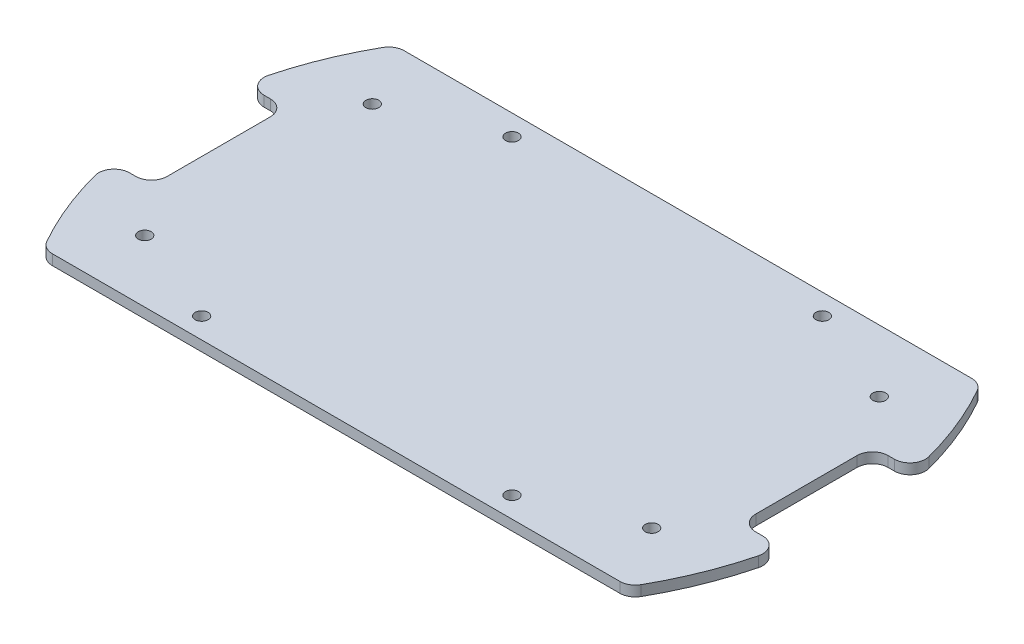
ISO-10303-21;
HEADER;
FILE_DESCRIPTION(('STEP AP214'),'2;1');
FILE_NAME('part.step','',(''),(''),'','','');
FILE_SCHEMA(('AUTOMOTIVE_DESIGN { 1 0 10303 214 1 1 1 1 }'));
ENDSEC;
DATA;
#1=APPLICATION_CONTEXT('core data for automotive mechanical design processes');
#2=APPLICATION_PROTOCOL_DEFINITION('international standard','automotive_design',2000,#1);
#3=PRODUCT_CONTEXT('',#1,'mechanical');
#4=PRODUCT('Part','Part','',(#3));
#5=PRODUCT_RELATED_PRODUCT_CATEGORY('part','',(#4));
#6=PRODUCT_DEFINITION_FORMATION('','',#4);
#7=PRODUCT_DEFINITION_CONTEXT('part definition',#1,'design');
#8=PRODUCT_DEFINITION('design','',#6,#7);
#9=PRODUCT_DEFINITION_SHAPE('','',#8);
#10=(LENGTH_UNIT() NAMED_UNIT(*) SI_UNIT(.MILLI.,.METRE.));
#11=(NAMED_UNIT(*) PLANE_ANGLE_UNIT() SI_UNIT($,.RADIAN.));
#12=(NAMED_UNIT(*) SI_UNIT($,.STERADIAN.) SOLID_ANGLE_UNIT());
#13=UNCERTAINTY_MEASURE_WITH_UNIT(LENGTH_MEASURE(1.E-05),#10,'distance_accuracy_value','');
#14=(GEOMETRIC_REPRESENTATION_CONTEXT(3) GLOBAL_UNCERTAINTY_ASSIGNED_CONTEXT((#13)) GLOBAL_UNIT_ASSIGNED_CONTEXT((#10,
#11,#12)) REPRESENTATION_CONTEXT('',''));
#15=CARTESIAN_POINT('',(0.,0.,0.));
#16=DIRECTION('',(0.,0.,1.));
#17=DIRECTION('',(1.,0.,0.));
#18=AXIS2_PLACEMENT_3D('',#15,#16,#17);
#19=CARTESIAN_POINT('',(-56.7070320753471,2.,0.));
#20=DIRECTION('',(1.,0.,0.));
#21=DIRECTION('',(0.,0.,-1.));
#22=AXIS2_PLACEMENT_3D('',#19,#20,#21);
#23=PLANE('',#22);
#24=DIRECTION('',(0.,0.,1.));
#25=VECTOR('',#24,1.);
#26=CARTESIAN_POINT('',(-56.7070320753471,0.,0.));
#27=LINE('',#26,#25);
#28=CARTESIAN_POINT('',(-56.7070320753471,0.,-9.99999999999999));
#29=VERTEX_POINT('',#28);
#30=CARTESIAN_POINT('',(-56.7070320753471,0.,9.98328326306578));
#31=VERTEX_POINT('',#30);
#32=EDGE_CURVE('E236',#29,#31,#27,.T.);
#33=ORIENTED_EDGE('',*,*,#32,.T.);
#34=DIRECTION('',(0.,-1.,0.));
#35=VECTOR('',#34,1.);
#36=CARTESIAN_POINT('',(-56.7070320753471,2.,9.98328326306578));
#37=LINE('',#36,#35);
#38=CARTESIAN_POINT('',(-56.7070320753471,2.,9.98328326306578));
#39=VERTEX_POINT('',#38);
#40=EDGE_CURVE('E331',#31,#39,#37,.F.);
#41=ORIENTED_EDGE('',*,*,#40,.T.);
#42=DIRECTION('',(0.,0.,1.));
#43=VECTOR('',#42,1.);
#44=CARTESIAN_POINT('',(-56.7070320753471,2.,0.));
#45=LINE('',#44,#43);
#46=CARTESIAN_POINT('',(-56.7070320753471,2.,-9.99999999999999));
#47=VERTEX_POINT('',#46);
#48=EDGE_CURVE('E226',#47,#39,#45,.T.);
#49=ORIENTED_EDGE('',*,*,#48,.F.);
#50=DIRECTION('',(0.,-1.,0.));
#51=VECTOR('',#50,1.);
#52=CARTESIAN_POINT('',(-56.7070320753471,0.,-9.99999999999999));
#53=LINE('',#52,#51);
#54=EDGE_CURVE('E328',#47,#29,#53,.T.);
#55=ORIENTED_EDGE('',*,*,#54,.T.);
#56=EDGE_LOOP('',(#33,#41,#49,#55));
#57=FACE_BOUND('',#56,.T.);
#58=ADVANCED_FACE('F35',(#57),#23,.F.);
#59=CARTESIAN_POINT('',(0.0426976868972404,2.,12.7837358563144));
#60=DIRECTION('',(-0.00333998208503997,0.,-0.99999442224428));
#61=DIRECTION('',(-0.99999442224428,0.,0.00333998208503997));
#62=AXIS2_PLACEMENT_3D('',#59,#60,#61);
#63=PLANE('',#62);
#64=DIRECTION('',(0.99999442224428,0.,-0.00333998208503997));
#65=VECTOR('',#64,1.);
#66=CARTESIAN_POINT('',(0.0426976868972404,2.,12.7837358563144));
#67=LINE('',#66,#65);
#68=CARTESIAN_POINT('',(-60.9477108585727,2.,12.987443864449));
#69=VERTEX_POINT('',#68);
#70=CARTESIAN_POINT('',(-59.697012129092,2.,12.9832665297986));
#71=VERTEX_POINT('',#70);
#72=EDGE_CURVE('E368',#69,#71,#67,.T.);
#73=ORIENTED_EDGE('',*,*,#72,.T.);
#74=DIRECTION('',(0.,-1.,0.));
#75=VECTOR('',#74,1.);
#76=CARTESIAN_POINT('',(-59.697012129092,2.,12.9832665297986));
#77=LINE('',#76,#75);
#78=CARTESIAN_POINT('',(-59.697012129092,0.,12.9832665297986));
#79=VERTEX_POINT('',#78);
#80=EDGE_CURVE('E325',#71,#79,#77,.T.);
#81=ORIENTED_EDGE('',*,*,#80,.T.);
#82=DIRECTION('',(0.99999442224428,0.,-0.00333998208503997));
#83=VECTOR('',#82,1.);
#84=CARTESIAN_POINT('',(0.0426976868972404,0.,12.7837358563144));
#85=LINE('',#84,#83);
#86=CARTESIAN_POINT('',(-60.9477108585727,0.,12.987443864449));
#87=VERTEX_POINT('',#86);
#88=EDGE_CURVE('E399',#87,#79,#85,.T.);
#89=ORIENTED_EDGE('',*,*,#88,.F.);
#90=DIRECTION('',(0.,1.,0.));
#91=VECTOR('',#90,1.);
#92=CARTESIAN_POINT('',(-60.9477108585727,2.,12.987443864449));
#93=LINE('',#92,#91);
#94=EDGE_CURVE('E323',#87,#69,#93,.T.);
#95=ORIENTED_EDGE('',*,*,#94,.T.);
#96=EDGE_LOOP('',(#73,#81,#89,#95));
#97=FACE_BOUND('',#96,.T.);
#98=ADVANCED_FACE('F438',(#97),#63,.T.);
#99=CARTESIAN_POINT('',(0.,2.,0.));
#100=DIRECTION('',(0.,-1.,0.));
#101=DIRECTION('',(0.,0.,-1.));
#102=AXIS2_PLACEMENT_3D('',#99,#100,#101);
#103=CYLINDRICAL_SURFACE('',#102,66.);
#104=CARTESIAN_POINT('',(0.,0.,0.));
#105=DIRECTION('',(0.,1.,0.));
#106=DIRECTION('',(0.,0.,1.));
#107=AXIS2_PLACEMENT_3D('',#104,#105,#106);
#108=CIRCLE('',#107,66.);
#109=CARTESIAN_POINT('',(-63.839485717666,0.,16.7487331850477));
#110=VERTEX_POINT('',#109);
#111=CARTESIAN_POINT('',(-57.4569147462183,0.,32.4761904761905));
#112=VERTEX_POINT('',#111);
#113=EDGE_CURVE('E402',#110,#112,#108,.T.);
#114=ORIENTED_EDGE('',*,*,#113,.T.);
#115=DIRECTION('',(0.,-1.,0.));
#116=VECTOR('',#115,1.);
#117=CARTESIAN_POINT('',(-57.4569147462183,2.,32.4761904761905));
#118=LINE('',#117,#116);
#119=CARTESIAN_POINT('',(-57.4569147462183,2.,32.4761904761905));
#120=VERTEX_POINT('',#119);
#121=EDGE_CURVE('E340',#112,#120,#118,.F.);
#122=ORIENTED_EDGE('',*,*,#121,.T.);
#123=CARTESIAN_POINT('',(0.,2.,0.));
#124=DIRECTION('',(0.,1.,0.));
#125=DIRECTION('',(0.,0.,1.));
#126=AXIS2_PLACEMENT_3D('',#123,#124,#125);
#127=CIRCLE('',#126,66.);
#128=CARTESIAN_POINT('',(-63.839485717666,2.,16.7487331850477));
#129=VERTEX_POINT('',#128);
#130=EDGE_CURVE('E371',#129,#120,#127,.T.);
#131=ORIENTED_EDGE('',*,*,#130,.F.);
#132=DIRECTION('',(0.,-1.,0.));
#133=VECTOR('',#132,1.);
#134=CARTESIAN_POINT('',(-63.839485717666,2.,16.7487331850477));
#135=LINE('',#134,#133);
#136=EDGE_CURVE('E337',#129,#110,#135,.T.);
#137=ORIENTED_EDGE('',*,*,#136,.T.);
#138=EDGE_LOOP('',(#114,#122,#131,#137));
#139=FACE_BOUND('',#138,.T.);
#140=ADVANCED_FACE('F443',(#139),#103,.T.);
#141=CARTESIAN_POINT('',(0.,2.,34.));
#142=DIRECTION('',(0.,0.,-1.));
#143=DIRECTION('',(-1.,0.,0.));
#144=AXIS2_PLACEMENT_3D('',#141,#142,#143);
#145=PLANE('',#144);
#146=DIRECTION('',(1.,0.,0.));
#147=VECTOR('',#146,1.);
#148=CARTESIAN_POINT('',(0.,0.,34.));
#149=LINE('',#148,#147);
#150=CARTESIAN_POINT('',(-54.8452368032084,0.,34.));
#151=VERTEX_POINT('',#150);
#152=CARTESIAN_POINT('',(54.8452368032084,0.,34.));
#153=VERTEX_POINT('',#152);
#154=EDGE_CURVE('E406',#151,#153,#149,.T.);
#155=ORIENTED_EDGE('',*,*,#154,.T.);
#156=DIRECTION('',(0.,-1.,0.));
#157=VECTOR('',#156,1.);
#158=CARTESIAN_POINT('',(54.8452368032084,2.,34.));
#159=LINE('',#158,#157);
#160=CARTESIAN_POINT('',(54.8452368032084,2.,34.));
#161=VERTEX_POINT('',#160);
#162=EDGE_CURVE('E321',#153,#161,#159,.F.);
#163=ORIENTED_EDGE('',*,*,#162,.T.);
#164=DIRECTION('',(1.,0.,0.));
#165=VECTOR('',#164,1.);
#166=CARTESIAN_POINT('',(0.,2.,34.));
#167=LINE('',#166,#165);
#168=CARTESIAN_POINT('',(-54.8452368032084,2.,34.));
#169=VERTEX_POINT('',#168);
#170=EDGE_CURVE('E382',#169,#161,#167,.T.);
#171=ORIENTED_EDGE('',*,*,#170,.F.);
#172=DIRECTION('',(0.,-1.,0.));
#173=VECTOR('',#172,1.);
#174=CARTESIAN_POINT('',(-54.8452368032084,2.,34.));
#175=LINE('',#174,#173);
#176=EDGE_CURVE('E318',#169,#151,#175,.T.);
#177=ORIENTED_EDGE('',*,*,#176,.T.);
#178=EDGE_LOOP('',(#155,#163,#171,#177));
#179=FACE_BOUND('',#178,.T.);
#180=ADVANCED_FACE('F498',(#179),#145,.F.);
#181=CARTESIAN_POINT('',(0.,2.,0.));
#182=DIRECTION('',(0.,-1.,0.));
#183=DIRECTION('',(0.,0.,-1.));
#184=AXIS2_PLACEMENT_3D('',#181,#182,#183);
#185=CYLINDRICAL_SURFACE('',#184,66.);
#186=CARTESIAN_POINT('',(0.,0.,0.));
#187=DIRECTION('',(0.,1.,0.));
#188=DIRECTION('',(0.,0.,1.));
#189=AXIS2_PLACEMENT_3D('',#186,#187,#188);
#190=CIRCLE('',#189,66.);
#191=CARTESIAN_POINT('',(57.4569147462183,0.,32.4761904761905));
#192=VERTEX_POINT('',#191);
#193=CARTESIAN_POINT('',(63.9499417109376,0.,16.3219164060989));
#194=VERTEX_POINT('',#193);
#195=EDGE_CURVE('E409',#192,#194,#190,.T.);
#196=ORIENTED_EDGE('',*,*,#195,.T.);
#197=DIRECTION('',(0.,-1.,0.));
#198=VECTOR('',#197,1.);
#199=CARTESIAN_POINT('',(63.9499417109376,2.,16.3219164060989));
#200=LINE('',#199,#198);
#201=CARTESIAN_POINT('',(63.9499417109376,2.,16.3219164060989));
#202=VERTEX_POINT('',#201);
#203=EDGE_CURVE('E316',#194,#202,#200,.F.);
#204=ORIENTED_EDGE('',*,*,#203,.T.);
#205=CARTESIAN_POINT('',(0.,2.,0.));
#206=DIRECTION('',(0.,1.,0.));
#207=DIRECTION('',(0.,0.,1.));
#208=AXIS2_PLACEMENT_3D('',#205,#206,#207);
#209=CIRCLE('',#208,66.);
#210=CARTESIAN_POINT('',(57.4569147462183,2.,32.4761904761905));
#211=VERTEX_POINT('',#210);
#212=EDGE_CURVE('E379',#211,#202,#209,.T.);
#213=ORIENTED_EDGE('',*,*,#212,.F.);
#214=DIRECTION('',(0.,-1.,0.));
#215=VECTOR('',#214,1.);
#216=CARTESIAN_POINT('',(57.4569147462183,2.,32.4761904761905));
#217=LINE('',#216,#215);
#218=EDGE_CURVE('E313',#211,#192,#217,.T.);
#219=ORIENTED_EDGE('',*,*,#218,.T.);
#220=EDGE_LOOP('',(#196,#204,#213,#219));
#221=FACE_BOUND('',#220,.T.);
#222=ADVANCED_FACE('F505',(#221),#185,.T.);
#223=CARTESIAN_POINT('',(59.7170520216022,0.,12.5844234701843));
#224=VERTEX_POINT('',#223);
#225=CARTESIAN_POINT('',(61.0331062323672,0.,12.5800278481797));
#226=VERTEX_POINT('',#225);
#227=EDGE_CURVE('E403',#224,#226,#85,.T.);
#228=ORIENTED_EDGE('',*,*,#227,.F.);
#229=DIRECTION('',(0.,-1.,0.));
#230=VECTOR('',#229,1.);
#231=CARTESIAN_POINT('',(59.7170520216022,2.,12.5844234701843));
#232=LINE('',#231,#230);
#233=CARTESIAN_POINT('',(59.7170520216022,2.,12.5844234701843));
#234=VERTEX_POINT('',#233);
#235=EDGE_CURVE('E311',#224,#234,#232,.F.);
#236=ORIENTED_EDGE('',*,*,#235,.T.);
#237=CARTESIAN_POINT('',(61.0331062323672,2.,12.5800278481797));
#238=VERTEX_POINT('',#237);
#239=EDGE_CURVE('E373',#234,#238,#67,.T.);
#240=ORIENTED_EDGE('',*,*,#239,.T.);
#241=DIRECTION('',(0.,1.,0.));
#242=VECTOR('',#241,1.);
#243=CARTESIAN_POINT('',(61.0331062323672,0.,12.5800278481797));
#244=LINE('',#243,#242);
#245=EDGE_CURVE('E308',#238,#226,#244,.F.);
#246=ORIENTED_EDGE('',*,*,#245,.T.);
#247=EDGE_LOOP('',(#228,#236,#240,#246));
#248=FACE_BOUND('',#247,.T.);
#249=ADVANCED_FACE('F446',(#248),#63,.T.);
#250=CARTESIAN_POINT('',(56.7070320753471,2.,0.));
#251=DIRECTION('',(1.,0.,0.));
#252=DIRECTION('',(0.,0.,-1.));
#253=AXIS2_PLACEMENT_3D('',#250,#251,#252);
#254=PLANE('',#253);
#255=DIRECTION('',(0.,0.,1.));
#256=VECTOR('',#255,1.);
#257=CARTESIAN_POINT('',(56.7070320753471,0.,0.));
#258=LINE('',#257,#256);
#259=CARTESIAN_POINT('',(56.7070320753471,0.,-9.99999999999999));
#260=VERTEX_POINT('',#259);
#261=CARTESIAN_POINT('',(56.7070320753471,0.,9.58444020345149));
#262=VERTEX_POINT('',#261);
#263=EDGE_CURVE('E412',#260,#262,#258,.T.);
#264=ORIENTED_EDGE('',*,*,#263,.F.);
#265=DIRECTION('',(0.,-1.,0.));
#266=VECTOR('',#265,1.);
#267=CARTESIAN_POINT('',(56.7070320753471,2.,-9.99999999999999));
#268=LINE('',#267,#266);
#269=CARTESIAN_POINT('',(56.7070320753471,2.,-9.99999999999999));
#270=VERTEX_POINT('',#269);
#271=EDGE_CURVE('E306',#260,#270,#268,.F.);
#272=ORIENTED_EDGE('',*,*,#271,.T.);
#273=DIRECTION('',(0.,0.,1.));
#274=VECTOR('',#273,1.);
#275=CARTESIAN_POINT('',(56.7070320753471,2.,0.));
#276=LINE('',#275,#274);
#277=CARTESIAN_POINT('',(56.7070320753471,2.,9.58444020345149));
#278=VERTEX_POINT('',#277);
#279=EDGE_CURVE('E378',#270,#278,#276,.T.);
#280=ORIENTED_EDGE('',*,*,#279,.T.);
#281=DIRECTION('',(0.,-1.,0.));
#282=VECTOR('',#281,1.);
#283=CARTESIAN_POINT('',(56.7070320753471,0.,9.58444020345149));
#284=LINE('',#283,#282);
#285=EDGE_CURVE('E303',#278,#262,#284,.T.);
#286=ORIENTED_EDGE('',*,*,#285,.T.);
#287=EDGE_LOOP('',(#264,#272,#280,#286));
#288=FACE_BOUND('',#287,.T.);
#289=ADVANCED_FACE('F520',(#288),#254,.T.);
#290=CARTESIAN_POINT('',(0.,2.,-13.));
#291=DIRECTION('',(0.,0.,-1.));
#292=DIRECTION('',(-1.,0.,0.));
#293=AXIS2_PLACEMENT_3D('',#290,#291,#292);
#294=PLANE('',#293);
#295=DIRECTION('',(1.,0.,0.));
#296=VECTOR('',#295,1.);
#297=CARTESIAN_POINT('',(0.,0.,-13.));
#298=LINE('',#297,#296);
#299=CARTESIAN_POINT('',(59.7070320753471,0.,-13.));
#300=VERTEX_POINT('',#299);
#301=CARTESIAN_POINT('',(60.9343909463285,0.,-13.));
#302=VERTEX_POINT('',#301);
#303=EDGE_CURVE('E228',#300,#302,#298,.T.);
#304=ORIENTED_EDGE('',*,*,#303,.T.);
#305=DIRECTION('',(0.,-1.,0.));
#306=VECTOR('',#305,1.);
#307=CARTESIAN_POINT('',(60.9343909463285,2.,-13.));
#308=LINE('',#307,#306);
#309=CARTESIAN_POINT('',(60.9343909463285,2.,-13.));
#310=VERTEX_POINT('',#309);
#311=EDGE_CURVE('E301',#302,#310,#308,.F.);
#312=ORIENTED_EDGE('',*,*,#311,.T.);
#313=DIRECTION('',(1.,0.,0.));
#314=VECTOR('',#313,1.);
#315=CARTESIAN_POINT('',(0.,2.,-13.));
#316=LINE('',#315,#314);
#317=CARTESIAN_POINT('',(59.7070320753471,2.,-13.));
#318=VERTEX_POINT('',#317);
#319=EDGE_CURVE('E389',#318,#310,#316,.T.);
#320=ORIENTED_EDGE('',*,*,#319,.F.);
#321=DIRECTION('',(0.,-1.,0.));
#322=VECTOR('',#321,1.);
#323=CARTESIAN_POINT('',(59.7070320753471,2.,-13.));
#324=LINE('',#323,#322);
#325=EDGE_CURVE('E298',#318,#300,#324,.T.);
#326=ORIENTED_EDGE('',*,*,#325,.T.);
#327=EDGE_LOOP('',(#304,#312,#320,#326));
#328=FACE_BOUND('',#327,.T.);
#329=ADVANCED_FACE('F435',(#328),#294,.F.);
#330=CARTESIAN_POINT('',(0.,2.,0.));
#331=DIRECTION('',(0.,-1.,0.));
#332=DIRECTION('',(0.,0.,-1.));
#333=AXIS2_PLACEMENT_3D('',#330,#331,#332);
#334=CYLINDRICAL_SURFACE('',#333,66.);
#335=CARTESIAN_POINT('',(0.,0.,0.));
#336=DIRECTION('',(0.,1.,0.));
#337=DIRECTION('',(0.,0.,1.));
#338=AXIS2_PLACEMENT_3D('',#335,#336,#337);
#339=CIRCLE('',#338,66.);
#340=CARTESIAN_POINT('',(63.8360286104394,0.,-16.7619047619048));
#341=VERTEX_POINT('',#340);
#342=CARTESIAN_POINT('',(57.4569147462183,0.,-32.4761904761905));
#343=VERTEX_POINT('',#342);
#344=EDGE_CURVE('E229',#341,#343,#339,.T.);
#345=ORIENTED_EDGE('',*,*,#344,.T.);
#346=DIRECTION('',(0.,-1.,0.));
#347=VECTOR('',#346,1.);
#348=CARTESIAN_POINT('',(57.4569147462183,2.,-32.4761904761905));
#349=LINE('',#348,#347);
#350=CARTESIAN_POINT('',(57.4569147462183,2.,-32.4761904761905));
#351=VERTEX_POINT('',#350);
#352=EDGE_CURVE('E296',#343,#351,#349,.F.);
#353=ORIENTED_EDGE('',*,*,#352,.T.);
#354=CARTESIAN_POINT('',(0.,2.,0.));
#355=DIRECTION('',(0.,1.,0.));
#356=DIRECTION('',(0.,0.,1.));
#357=AXIS2_PLACEMENT_3D('',#354,#355,#356);
#358=CIRCLE('',#357,66.);
#359=CARTESIAN_POINT('',(63.8360286104394,2.,-16.7619047619048));
#360=VERTEX_POINT('',#359);
#361=EDGE_CURVE('E391',#360,#351,#358,.T.);
#362=ORIENTED_EDGE('',*,*,#361,.F.);
#363=DIRECTION('',(0.,-1.,0.));
#364=VECTOR('',#363,1.);
#365=CARTESIAN_POINT('',(63.8360286104394,2.,-16.7619047619048));
#366=LINE('',#365,#364);
#367=EDGE_CURVE('E293',#360,#341,#366,.T.);
#368=ORIENTED_EDGE('',*,*,#367,.T.);
#369=EDGE_LOOP('',(#345,#353,#362,#368));
#370=FACE_BOUND('',#369,.T.);
#371=ADVANCED_FACE('F419',(#370),#334,.T.);
#372=CARTESIAN_POINT('',(0.,2.,-34.));
#373=DIRECTION('',(0.,0.,-1.));
#374=DIRECTION('',(-1.,0.,0.));
#375=AXIS2_PLACEMENT_3D('',#372,#373,#374);
#376=PLANE('',#375);
#377=DIRECTION('',(1.,0.,0.));
#378=VECTOR('',#377,1.);
#379=CARTESIAN_POINT('',(0.,0.,-34.));
#380=LINE('',#379,#378);
#381=CARTESIAN_POINT('',(-54.8452368032084,0.,-34.));
#382=VERTEX_POINT('',#381);
#383=CARTESIAN_POINT('',(54.8452368032084,0.,-34.));
#384=VERTEX_POINT('',#383);
#385=EDGE_CURVE('E224',#382,#384,#380,.T.);
#386=ORIENTED_EDGE('',*,*,#385,.F.);
#387=DIRECTION('',(0.,1.,0.));
#388=VECTOR('',#387,1.);
#389=CARTESIAN_POINT('',(-54.8452368032084,2.,-34.));
#390=LINE('',#389,#388);
#391=CARTESIAN_POINT('',(-54.8452368032084,2.,-34.));
#392=VERTEX_POINT('',#391);
#393=EDGE_CURVE('E202',#382,#392,#390,.T.);
#394=ORIENTED_EDGE('',*,*,#393,.T.);
#395=DIRECTION('',(1.,0.,0.));
#396=VECTOR('',#395,1.);
#397=CARTESIAN_POINT('',(0.,2.,-34.));
#398=LINE('',#397,#396);
#399=CARTESIAN_POINT('',(54.8452368032084,2.,-34.));
#400=VERTEX_POINT('',#399);
#401=EDGE_CURVE('E394',#392,#400,#398,.T.);
#402=ORIENTED_EDGE('',*,*,#401,.T.);
#403=DIRECTION('',(0.,1.,0.));
#404=VECTOR('',#403,1.);
#405=CARTESIAN_POINT('',(54.8452368032084,0.,-34.));
#406=LINE('',#405,#404);
#407=EDGE_CURVE('E207',#400,#384,#406,.F.);
#408=ORIENTED_EDGE('',*,*,#407,.T.);
#409=EDGE_LOOP('',(#386,#394,#402,#408));
#410=FACE_BOUND('',#409,.T.);
#411=ADVANCED_FACE('F427',(#410),#376,.T.);
#412=CARTESIAN_POINT('',(0.,2.,0.));
#413=DIRECTION('',(0.,-1.,0.));
#414=DIRECTION('',(0.,0.,-1.));
#415=AXIS2_PLACEMENT_3D('',#412,#413,#414);
#416=CYLINDRICAL_SURFACE('',#415,66.);
#417=CARTESIAN_POINT('',(0.,2.,0.));
#418=DIRECTION('',(0.,1.,0.));
#419=DIRECTION('',(0.,0.,1.));
#420=AXIS2_PLACEMENT_3D('',#417,#418,#419);
#421=CIRCLE('',#420,66.);
#422=CARTESIAN_POINT('',(-57.4569147462183,2.,-32.4761904761905));
#423=VERTEX_POINT('',#422);
#424=CARTESIAN_POINT('',(-63.8360286104394,2.,-16.7619047619048));
#425=VERTEX_POINT('',#424);
#426=EDGE_CURVE('E216',#423,#425,#421,.T.);
#427=ORIENTED_EDGE('',*,*,#426,.F.);
#428=DIRECTION('',(0.,-1.,0.));
#429=VECTOR('',#428,1.);
#430=CARTESIAN_POINT('',(-57.4569147462183,2.,-32.4761904761905));
#431=LINE('',#430,#429);
#432=CARTESIAN_POINT('',(-57.4569147462183,0.,-32.4761904761905));
#433=VERTEX_POINT('',#432);
#434=EDGE_CURVE('E201',#423,#433,#431,.T.);
#435=ORIENTED_EDGE('',*,*,#434,.T.);
#436=CARTESIAN_POINT('',(0.,0.,0.));
#437=DIRECTION('',(0.,1.,0.));
#438=DIRECTION('',(0.,0.,1.));
#439=AXIS2_PLACEMENT_3D('',#436,#437,#438);
#440=CIRCLE('',#439,66.);
#441=CARTESIAN_POINT('',(-63.8360286104394,0.,-16.7619047619048));
#442=VERTEX_POINT('',#441);
#443=EDGE_CURVE('E214',#433,#442,#440,.T.);
#444=ORIENTED_EDGE('',*,*,#443,.T.);
#445=DIRECTION('',(0.,-1.,0.));
#446=VECTOR('',#445,1.);
#447=CARTESIAN_POINT('',(-63.8360286104394,2.,-16.7619047619048));
#448=LINE('',#447,#446);
#449=EDGE_CURVE('E218',#442,#425,#448,.F.);
#450=ORIENTED_EDGE('',*,*,#449,.T.);
#451=EDGE_LOOP('',(#427,#435,#444,#450));
#452=FACE_BOUND('',#451,.T.);
#453=ADVANCED_FACE('F213',(#452),#416,.T.);
#454=CARTESIAN_POINT('',(-60.9343909463285,0.,-13.));
#455=VERTEX_POINT('',#454);
#456=CARTESIAN_POINT('',(-59.7070320753471,0.,-13.));
#457=VERTEX_POINT('',#456);
#458=EDGE_CURVE('E223',#455,#457,#298,.T.);
#459=ORIENTED_EDGE('',*,*,#458,.T.);
#460=DIRECTION('',(0.,-1.,0.));
#461=VECTOR('',#460,1.);
#462=CARTESIAN_POINT('',(-59.7070320753471,2.,-13.));
#463=LINE('',#462,#461);
#464=CARTESIAN_POINT('',(-59.7070320753471,2.,-13.));
#465=VERTEX_POINT('',#464);
#466=EDGE_CURVE('E50',#457,#465,#463,.F.);
#467=ORIENTED_EDGE('',*,*,#466,.T.);
#468=CARTESIAN_POINT('',(-60.9343909463285,2.,-13.));
#469=VERTEX_POINT('',#468);
#470=EDGE_CURVE('E262',#469,#465,#316,.T.);
#471=ORIENTED_EDGE('',*,*,#470,.F.);
#472=DIRECTION('',(0.,-1.,0.));
#473=VECTOR('',#472,1.);
#474=CARTESIAN_POINT('',(-60.9343909463285,2.,-13.));
#475=LINE('',#474,#473);
#476=EDGE_CURVE('E333',#469,#455,#475,.T.);
#477=ORIENTED_EDGE('',*,*,#476,.T.);
#478=EDGE_LOOP('',(#459,#467,#471,#477));
#479=FACE_BOUND('',#478,.T.);
#480=ADVANCED_FACE('F357',(#479),#294,.F.);
#481=CARTESIAN_POINT('',(0.,2.,0.));
#482=DIRECTION('',(0.,1.,0.));
#483=DIRECTION('',(0.,0.,1.));
#484=AXIS2_PLACEMENT_3D('',#481,#482,#483);
#485=PLANE('',#484);
#486=CARTESIAN_POINT('',(49.,2.,22.));
#487=DIRECTION('',(0.,1.,0.));
#488=DIRECTION('',(0.,0.,1.));
#489=AXIS2_PLACEMENT_3D('',#486,#487,#488);
#490=CIRCLE('',#489,1.25);
#491=CARTESIAN_POINT('',(49.,2.,23.25));
#492=VERTEX_POINT('',#491);
#493=EDGE_CURVE('E602',#492,#492,#490,.T.);
#494=ORIENTED_EDGE('',*,*,#493,.F.);
#495=EDGE_LOOP('',(#494));
#496=FACE_BOUND('',#495,.T.);
#497=CARTESIAN_POINT('',(49.,2.,-22.));
#498=DIRECTION('',(0.,1.,0.));
#499=DIRECTION('',(0.,0.,1.));
#500=AXIS2_PLACEMENT_3D('',#497,#498,#499);
#501=CIRCLE('',#500,1.25);
#502=CARTESIAN_POINT('',(49.,2.,-20.75));
#503=VERTEX_POINT('',#502);
#504=EDGE_CURVE('E261',#503,#503,#501,.T.);
#505=ORIENTED_EDGE('',*,*,#504,.F.);
#506=EDGE_LOOP('',(#505));
#507=FACE_BOUND('',#506,.T.);
#508=CARTESIAN_POINT('',(-49.,2.,22.));
#509=DIRECTION('',(0.,1.,0.));
#510=DIRECTION('',(0.,0.,1.));
#511=AXIS2_PLACEMENT_3D('',#508,#509,#510);
#512=CIRCLE('',#511,1.25);
#513=CARTESIAN_POINT('',(-49.,2.,23.25));
#514=VERTEX_POINT('',#513);
#515=EDGE_CURVE('E257',#514,#514,#512,.T.);
#516=ORIENTED_EDGE('',*,*,#515,.F.);
#517=EDGE_LOOP('',(#516));
#518=FACE_BOUND('',#517,.T.);
#519=CARTESIAN_POINT('',(-49.,2.,-22.));
#520=DIRECTION('',(0.,1.,0.));
#521=DIRECTION('',(0.,0.,1.));
#522=AXIS2_PLACEMENT_3D('',#519,#520,#521);
#523=CIRCLE('',#522,1.25);
#524=CARTESIAN_POINT('',(-49.,2.,-20.75));
#525=VERTEX_POINT('',#524);
#526=EDGE_CURVE('E253',#525,#525,#523,.T.);
#527=ORIENTED_EDGE('',*,*,#526,.F.);
#528=EDGE_LOOP('',(#527));
#529=FACE_BOUND('',#528,.T.);
#530=CARTESIAN_POINT('',(-30.,2.,-30.));
#531=DIRECTION('',(0.,1.,0.));
#532=DIRECTION('',(0.,0.,1.));
#533=AXIS2_PLACEMENT_3D('',#530,#531,#532);
#534=CIRCLE('',#533,1.25);
#535=CARTESIAN_POINT('',(-30.,2.,-28.75));
#536=VERTEX_POINT('',#535);
#537=EDGE_CURVE('E249',#536,#536,#534,.T.);
#538=ORIENTED_EDGE('',*,*,#537,.F.);
#539=EDGE_LOOP('',(#538));
#540=FACE_BOUND('',#539,.T.);
#541=CARTESIAN_POINT('',(-29.9999999999983,2.,30.));
#542=DIRECTION('',(0.,1.,0.));
#543=DIRECTION('',(0.,0.,1.));
#544=AXIS2_PLACEMENT_3D('',#541,#542,#543);
#545=CIRCLE('',#544,1.25);
#546=CARTESIAN_POINT('',(-29.9999999999983,2.,31.25));
#547=VERTEX_POINT('',#546);
#548=EDGE_CURVE('E245',#547,#547,#545,.T.);
#549=ORIENTED_EDGE('',*,*,#548,.F.);
#550=EDGE_LOOP('',(#549));
#551=FACE_BOUND('',#550,.T.);
#552=CARTESIAN_POINT('',(30.,2.,-30.0000000000017));
#553=DIRECTION('',(0.,1.,0.));
#554=DIRECTION('',(0.,0.,1.));
#555=AXIS2_PLACEMENT_3D('',#552,#553,#554);
#556=CIRCLE('',#555,1.25);
#557=CARTESIAN_POINT('',(30.,2.,-28.7500000000017));
#558=VERTEX_POINT('',#557);
#559=EDGE_CURVE('E241',#558,#558,#556,.T.);
#560=ORIENTED_EDGE('',*,*,#559,.F.);
#561=EDGE_LOOP('',(#560));
#562=FACE_BOUND('',#561,.T.);
#563=CARTESIAN_POINT('',(30.0000000000017,2.,29.9999999999983));
#564=DIRECTION('',(0.,1.,0.));
#565=DIRECTION('',(0.,0.,1.));
#566=AXIS2_PLACEMENT_3D('',#563,#564,#565);
#567=CIRCLE('',#566,1.25);
#568=CARTESIAN_POINT('',(30.0000000000017,2.,31.2499999999983));
#569=VERTEX_POINT('',#568);
#570=EDGE_CURVE('E237',#569,#569,#567,.T.);
#571=ORIENTED_EDGE('',*,*,#570,.F.);
#572=EDGE_LOOP('',(#571));
#573=FACE_BOUND('',#572,.T.);
#574=ORIENTED_EDGE('',*,*,#401,.F.);
#575=CARTESIAN_POINT('',(-54.8452368032084,2.,-31.));
#576=DIRECTION('',(0.,1.,0.));
#577=DIRECTION('',(0.,0.,1.));
#578=AXIS2_PLACEMENT_3D('',#575,#576,#577);
#579=CIRCLE('',#578,3.);
#580=EDGE_CURVE('E291',#392,#423,#579,.T.);
#581=ORIENTED_EDGE('',*,*,#580,.T.);
#582=ORIENTED_EDGE('',*,*,#426,.T.);
#583=CARTESIAN_POINT('',(-60.9343909463285,2.,-16.));
#584=DIRECTION('',(0.,1.,0.));
#585=DIRECTION('',(0.,0.,1.));
#586=AXIS2_PLACEMENT_3D('',#583,#584,#585);
#587=CIRCLE('',#586,3.);
#588=EDGE_CURVE('E57',#425,#469,#587,.T.);
#589=ORIENTED_EDGE('',*,*,#588,.T.);
#590=ORIENTED_EDGE('',*,*,#470,.T.);
#591=CARTESIAN_POINT('',(-59.7070320753471,2.,-9.99999999999999));
#592=DIRECTION('',(0.,1.,0.));
#593=DIRECTION('',(0.,0.,1.));
#594=AXIS2_PLACEMENT_3D('',#591,#592,#593);
#595=CIRCLE('',#594,3.);
#596=EDGE_CURVE('E11',#465,#47,#595,.F.);
#597=ORIENTED_EDGE('',*,*,#596,.T.);
#598=ORIENTED_EDGE('',*,*,#48,.T.);
#599=CARTESIAN_POINT('',(-59.7070320753471,2.,9.98328326306578));
#600=DIRECTION('',(0.,1.,0.));
#601=DIRECTION('',(0.,0.,1.));
#602=AXIS2_PLACEMENT_3D('',#599,#600,#601);
#603=CIRCLE('',#602,3.);
#604=EDGE_CURVE('E352',#39,#71,#603,.F.);
#605=ORIENTED_EDGE('',*,*,#604,.T.);
#606=ORIENTED_EDGE('',*,*,#72,.F.);
#607=CARTESIAN_POINT('',(-60.9376909123176,2.,15.9874271311819));
#608=DIRECTION('',(0.,1.,0.));
#609=DIRECTION('',(0.,0.,1.));
#610=AXIS2_PLACEMENT_3D('',#607,#608,#609);
#611=CIRCLE('',#610,3.);
#612=EDGE_CURVE('E278',#69,#129,#611,.T.);
#613=ORIENTED_EDGE('',*,*,#612,.T.);
#614=ORIENTED_EDGE('',*,*,#130,.T.);
#615=CARTESIAN_POINT('',(-54.8452368032084,2.,31.));
#616=DIRECTION('',(0.,1.,0.));
#617=DIRECTION('',(0.,0.,1.));
#618=AXIS2_PLACEMENT_3D('',#615,#616,#617);
#619=CIRCLE('',#618,3.);
#620=EDGE_CURVE('E280',#120,#169,#619,.T.);
#621=ORIENTED_EDGE('',*,*,#620,.T.);
#622=ORIENTED_EDGE('',*,*,#170,.T.);
#623=CARTESIAN_POINT('',(54.8452368032084,2.,31.));
#624=DIRECTION('',(0.,1.,0.));
#625=DIRECTION('',(0.,0.,1.));
#626=AXIS2_PLACEMENT_3D('',#623,#624,#625);
#627=CIRCLE('',#626,3.);
#628=EDGE_CURVE('E283',#161,#211,#627,.T.);
#629=ORIENTED_EDGE('',*,*,#628,.T.);
#630=ORIENTED_EDGE('',*,*,#212,.T.);
#631=CARTESIAN_POINT('',(61.0431261786223,2.,15.5800111149126));
#632=DIRECTION('',(0.,1.,0.));
#633=DIRECTION('',(0.,0.,1.));
#634=AXIS2_PLACEMENT_3D('',#631,#632,#633);
#635=CIRCLE('',#634,3.);
#636=EDGE_CURVE('E285',#202,#238,#635,.T.);
#637=ORIENTED_EDGE('',*,*,#636,.T.);
#638=ORIENTED_EDGE('',*,*,#239,.F.);
#639=CARTESIAN_POINT('',(59.7070320753471,2.,9.58444020345149));
#640=DIRECTION('',(0.,1.,0.));
#641=DIRECTION('',(0.,0.,1.));
#642=AXIS2_PLACEMENT_3D('',#639,#640,#641);
#643=CIRCLE('',#642,3.);
#644=EDGE_CURVE('E348',#234,#278,#643,.F.);
#645=ORIENTED_EDGE('',*,*,#644,.T.);
#646=ORIENTED_EDGE('',*,*,#279,.F.);
#647=CARTESIAN_POINT('',(59.7070320753471,2.,-9.99999999999999));
#648=DIRECTION('',(0.,1.,0.));
#649=DIRECTION('',(0.,0.,1.));
#650=AXIS2_PLACEMENT_3D('',#647,#648,#649);
#651=CIRCLE('',#650,3.);
#652=EDGE_CURVE('E344',#270,#318,#651,.F.);
#653=ORIENTED_EDGE('',*,*,#652,.T.);
#654=ORIENTED_EDGE('',*,*,#319,.T.);
#655=CARTESIAN_POINT('',(60.9343909463285,2.,-16.));
#656=DIRECTION('',(0.,1.,0.));
#657=DIRECTION('',(0.,0.,1.));
#658=AXIS2_PLACEMENT_3D('',#655,#656,#657);
#659=CIRCLE('',#658,3.);
#660=EDGE_CURVE('E287',#310,#360,#659,.T.);
#661=ORIENTED_EDGE('',*,*,#660,.T.);
#662=ORIENTED_EDGE('',*,*,#361,.T.);
#663=CARTESIAN_POINT('',(54.8452368032084,2.,-31.));
#664=DIRECTION('',(0.,1.,0.));
#665=DIRECTION('',(0.,0.,1.));
#666=AXIS2_PLACEMENT_3D('',#663,#664,#665);
#667=CIRCLE('',#666,3.);
#668=EDGE_CURVE('E289',#351,#400,#667,.T.);
#669=ORIENTED_EDGE('',*,*,#668,.T.);
#670=EDGE_LOOP('',(#574,#581,#582,#589,#590,#597,#598,#605,#606,#613,#614,#621,#622,#629,#630,
#637,#638,#645,#646,#653,#654,#661,#662,#669));
#671=FACE_BOUND('',#670,.T.);
#672=ADVANCED_FACE('F364',(#496,#507,#518,#529,#540,#551,#562,#573,#671),#485,.T.);
#673=CARTESIAN_POINT('',(0.,0.,0.));
#674=DIRECTION('',(0.,1.,0.));
#675=DIRECTION('',(0.,0.,1.));
#676=AXIS2_PLACEMENT_3D('',#673,#674,#675);
#677=PLANE('',#676);
#678=CARTESIAN_POINT('',(49.,0.,22.));
#679=DIRECTION('',(0.,1.,0.));
#680=DIRECTION('',(0.,0.,1.));
#681=AXIS2_PLACEMENT_3D('',#678,#679,#680);
#682=CIRCLE('',#681,1.25);
#683=CARTESIAN_POINT('',(49.,0.,23.25));
#684=VERTEX_POINT('',#683);
#685=EDGE_CURVE('E605',#684,#684,#682,.T.);
#686=ORIENTED_EDGE('',*,*,#685,.T.);
#687=EDGE_LOOP('',(#686));
#688=FACE_BOUND('',#687,.T.);
#689=CARTESIAN_POINT('',(49.,0.,-22.));
#690=DIRECTION('',(0.,1.,0.));
#691=DIRECTION('',(0.,0.,1.));
#692=AXIS2_PLACEMENT_3D('',#689,#690,#691);
#693=CIRCLE('',#692,1.25);
#694=CARTESIAN_POINT('',(49.,0.,-20.75));
#695=VERTEX_POINT('',#694);
#696=EDGE_CURVE('E258',#695,#695,#693,.T.);
#697=ORIENTED_EDGE('',*,*,#696,.T.);
#698=EDGE_LOOP('',(#697));
#699=FACE_BOUND('',#698,.T.);
#700=CARTESIAN_POINT('',(-49.,0.,22.));
#701=DIRECTION('',(0.,1.,0.));
#702=DIRECTION('',(0.,0.,1.));
#703=AXIS2_PLACEMENT_3D('',#700,#701,#702);
#704=CIRCLE('',#703,1.25);
#705=CARTESIAN_POINT('',(-49.,0.,23.25));
#706=VERTEX_POINT('',#705);
#707=EDGE_CURVE('E254',#706,#706,#704,.T.);
#708=ORIENTED_EDGE('',*,*,#707,.T.);
#709=EDGE_LOOP('',(#708));
#710=FACE_BOUND('',#709,.T.);
#711=CARTESIAN_POINT('',(-49.,0.,-22.));
#712=DIRECTION('',(0.,1.,0.));
#713=DIRECTION('',(0.,0.,1.));
#714=AXIS2_PLACEMENT_3D('',#711,#712,#713);
#715=CIRCLE('',#714,1.25);
#716=CARTESIAN_POINT('',(-49.,0.,-20.75));
#717=VERTEX_POINT('',#716);
#718=EDGE_CURVE('E250',#717,#717,#715,.T.);
#719=ORIENTED_EDGE('',*,*,#718,.T.);
#720=EDGE_LOOP('',(#719));
#721=FACE_BOUND('',#720,.T.);
#722=CARTESIAN_POINT('',(-30.,0.,-30.));
#723=DIRECTION('',(0.,1.,0.));
#724=DIRECTION('',(0.,0.,1.));
#725=AXIS2_PLACEMENT_3D('',#722,#723,#724);
#726=CIRCLE('',#725,1.25);
#727=CARTESIAN_POINT('',(-30.,0.,-28.75));
#728=VERTEX_POINT('',#727);
#729=EDGE_CURVE('E246',#728,#728,#726,.T.);
#730=ORIENTED_EDGE('',*,*,#729,.T.);
#731=EDGE_LOOP('',(#730));
#732=FACE_BOUND('',#731,.T.);
#733=CARTESIAN_POINT('',(-29.9999999999983,0.,30.));
#734=DIRECTION('',(0.,1.,0.));
#735=DIRECTION('',(0.,0.,1.));
#736=AXIS2_PLACEMENT_3D('',#733,#734,#735);
#737=CIRCLE('',#736,1.25);
#738=CARTESIAN_POINT('',(-29.9999999999983,0.,31.25));
#739=VERTEX_POINT('',#738);
#740=EDGE_CURVE('E242',#739,#739,#737,.T.);
#741=ORIENTED_EDGE('',*,*,#740,.T.);
#742=EDGE_LOOP('',(#741));
#743=FACE_BOUND('',#742,.T.);
#744=CARTESIAN_POINT('',(30.,0.,-30.0000000000017));
#745=DIRECTION('',(0.,1.,0.));
#746=DIRECTION('',(0.,0.,1.));
#747=AXIS2_PLACEMENT_3D('',#744,#745,#746);
#748=CIRCLE('',#747,1.25);
#749=CARTESIAN_POINT('',(30.,0.,-28.7500000000017));
#750=VERTEX_POINT('',#749);
#751=EDGE_CURVE('E238',#750,#750,#748,.T.);
#752=ORIENTED_EDGE('',*,*,#751,.T.);
#753=EDGE_LOOP('',(#752));
#754=FACE_BOUND('',#753,.T.);
#755=CARTESIAN_POINT('',(30.0000000000017,0.,29.9999999999983));
#756=DIRECTION('',(0.,1.,0.));
#757=DIRECTION('',(0.,0.,1.));
#758=AXIS2_PLACEMENT_3D('',#755,#756,#757);
#759=CIRCLE('',#758,1.25);
#760=CARTESIAN_POINT('',(30.0000000000017,0.,31.2499999999983));
#761=VERTEX_POINT('',#760);
#762=EDGE_CURVE('E233',#761,#761,#759,.T.);
#763=ORIENTED_EDGE('',*,*,#762,.T.);
#764=EDGE_LOOP('',(#763));
#765=FACE_BOUND('',#764,.T.);
#766=ORIENTED_EDGE('',*,*,#443,.F.);
#767=CARTESIAN_POINT('',(-54.8452368032084,0.,-31.));
#768=DIRECTION('',(0.,1.,0.));
#769=DIRECTION('',(0.,0.,1.));
#770=AXIS2_PLACEMENT_3D('',#767,#768,#769);
#771=CIRCLE('',#770,3.);
#772=EDGE_CURVE('E197',#433,#382,#771,.F.);
#773=ORIENTED_EDGE('',*,*,#772,.T.);
#774=ORIENTED_EDGE('',*,*,#385,.T.);
#775=CARTESIAN_POINT('',(54.8452368032084,0.,-31.));
#776=DIRECTION('',(0.,1.,0.));
#777=DIRECTION('',(0.,0.,1.));
#778=AXIS2_PLACEMENT_3D('',#775,#776,#777);
#779=CIRCLE('',#778,3.);
#780=EDGE_CURVE('E208',#384,#343,#779,.F.);
#781=ORIENTED_EDGE('',*,*,#780,.T.);
#782=ORIENTED_EDGE('',*,*,#344,.F.);
#783=CARTESIAN_POINT('',(60.9343909463285,0.,-16.));
#784=DIRECTION('',(0.,1.,0.));
#785=DIRECTION('',(0.,0.,1.));
#786=AXIS2_PLACEMENT_3D('',#783,#784,#785);
#787=CIRCLE('',#786,3.);
#788=EDGE_CURVE('E272',#341,#302,#787,.F.);
#789=ORIENTED_EDGE('',*,*,#788,.T.);
#790=ORIENTED_EDGE('',*,*,#303,.F.);
#791=CARTESIAN_POINT('',(59.7070320753471,0.,-9.99999999999999));
#792=DIRECTION('',(0.,1.,0.));
#793=DIRECTION('',(0.,0.,1.));
#794=AXIS2_PLACEMENT_3D('',#791,#792,#793);
#795=CIRCLE('',#794,3.);
#796=EDGE_CURVE('E342',#300,#260,#795,.T.);
#797=ORIENTED_EDGE('',*,*,#796,.T.);
#798=ORIENTED_EDGE('',*,*,#263,.T.);
#799=CARTESIAN_POINT('',(59.7070320753471,0.,9.58444020345149));
#800=DIRECTION('',(0.,1.,0.));
#801=DIRECTION('',(0.,0.,1.));
#802=AXIS2_PLACEMENT_3D('',#799,#800,#801);
#803=CIRCLE('',#802,3.);
#804=EDGE_CURVE('E346',#262,#224,#803,.T.);
#805=ORIENTED_EDGE('',*,*,#804,.T.);
#806=ORIENTED_EDGE('',*,*,#227,.T.);
#807=CARTESIAN_POINT('',(61.0431261786223,0.,15.5800111149126));
#808=DIRECTION('',(0.,1.,0.));
#809=DIRECTION('',(0.,0.,1.));
#810=AXIS2_PLACEMENT_3D('',#807,#808,#809);
#811=CIRCLE('',#810,3.);
#812=EDGE_CURVE('E270',#226,#194,#811,.F.);
#813=ORIENTED_EDGE('',*,*,#812,.T.);
#814=ORIENTED_EDGE('',*,*,#195,.F.);
#815=CARTESIAN_POINT('',(54.8452368032084,0.,31.));
#816=DIRECTION('',(0.,1.,0.));
#817=DIRECTION('',(0.,0.,1.));
#818=AXIS2_PLACEMENT_3D('',#815,#816,#817);
#819=CIRCLE('',#818,3.);
#820=EDGE_CURVE('E268',#192,#153,#819,.F.);
#821=ORIENTED_EDGE('',*,*,#820,.T.);
#822=ORIENTED_EDGE('',*,*,#154,.F.);
#823=CARTESIAN_POINT('',(-54.8452368032084,0.,31.));
#824=DIRECTION('',(0.,1.,0.));
#825=DIRECTION('',(0.,0.,1.));
#826=AXIS2_PLACEMENT_3D('',#823,#824,#825);
#827=CIRCLE('',#826,3.);
#828=EDGE_CURVE('E265',#151,#112,#827,.F.);
#829=ORIENTED_EDGE('',*,*,#828,.T.);
#830=ORIENTED_EDGE('',*,*,#113,.F.);
#831=CARTESIAN_POINT('',(-60.9376909123176,0.,15.9874271311819));
#832=DIRECTION('',(0.,1.,0.));
#833=DIRECTION('',(0.,0.,1.));
#834=AXIS2_PLACEMENT_3D('',#831,#832,#833);
#835=CIRCLE('',#834,3.);
#836=EDGE_CURVE('E217',#110,#87,#835,.F.);
#837=ORIENTED_EDGE('',*,*,#836,.T.);
#838=ORIENTED_EDGE('',*,*,#88,.T.);
#839=CARTESIAN_POINT('',(-59.7070320753471,0.,9.98328326306578));
#840=DIRECTION('',(0.,1.,0.));
#841=DIRECTION('',(0.,0.,1.));
#842=AXIS2_PLACEMENT_3D('',#839,#840,#841);
#843=CIRCLE('',#842,3.);
#844=EDGE_CURVE('E350',#79,#31,#843,.T.);
#845=ORIENTED_EDGE('',*,*,#844,.T.);
#846=ORIENTED_EDGE('',*,*,#32,.F.);
#847=CARTESIAN_POINT('',(-59.7070320753471,0.,-9.99999999999999));
#848=DIRECTION('',(0.,1.,0.));
#849=DIRECTION('',(0.,0.,1.));
#850=AXIS2_PLACEMENT_3D('',#847,#848,#849);
#851=CIRCLE('',#850,3.);
#852=EDGE_CURVE('E43',#29,#457,#851,.T.);
#853=ORIENTED_EDGE('',*,*,#852,.T.);
#854=ORIENTED_EDGE('',*,*,#458,.F.);
#855=CARTESIAN_POINT('',(-60.9343909463285,0.,-16.));
#856=DIRECTION('',(0.,1.,0.));
#857=DIRECTION('',(0.,0.,1.));
#858=AXIS2_PLACEMENT_3D('',#855,#856,#857);
#859=CIRCLE('',#858,3.);
#860=EDGE_CURVE('E222',#455,#442,#859,.F.);
#861=ORIENTED_EDGE('',*,*,#860,.T.);
#862=EDGE_LOOP('',(#766,#773,#774,#781,#782,#789,#790,#797,#798,#805,#806,#813,#814,#821,#822,
#829,#830,#837,#838,#845,#846,#853,#854,#861));
#863=FACE_BOUND('',#862,.T.);
#864=ADVANCED_FACE('F220',(#688,#699,#710,#721,#732,#743,#754,#765,#863),#677,.F.);
#865=CARTESIAN_POINT('',(30.0000000000017,2.,29.9999999999983));
#866=DIRECTION('',(0.,1.,0.));
#867=DIRECTION('',(0.,0.,1.));
#868=AXIS2_PLACEMENT_3D('',#865,#866,#867);
#869=CYLINDRICAL_SURFACE('',#868,1.25);
#870=ORIENTED_EDGE('',*,*,#570,.T.);
#871=EDGE_LOOP('',(#870));
#872=FACE_BOUND('',#871,.T.);
#873=ORIENTED_EDGE('',*,*,#762,.F.);
#874=EDGE_LOOP('',(#873));
#875=FACE_BOUND('',#874,.T.);
#876=ADVANCED_FACE('F564',(#872,#875),#869,.F.);
#877=CARTESIAN_POINT('',(30.,2.,-30.0000000000017));
#878=DIRECTION('',(0.,1.,0.));
#879=DIRECTION('',(0.,0.,1.));
#880=AXIS2_PLACEMENT_3D('',#877,#878,#879);
#881=CYLINDRICAL_SURFACE('',#880,1.25);
#882=ORIENTED_EDGE('',*,*,#559,.T.);
#883=EDGE_LOOP('',(#882));
#884=FACE_BOUND('',#883,.T.);
#885=ORIENTED_EDGE('',*,*,#751,.F.);
#886=EDGE_LOOP('',(#885));
#887=FACE_BOUND('',#886,.T.);
#888=ADVANCED_FACE('F571',(#884,#887),#881,.F.);
#889=CARTESIAN_POINT('',(-29.9999999999983,2.,30.));
#890=DIRECTION('',(0.,1.,0.));
#891=DIRECTION('',(0.,0.,1.));
#892=AXIS2_PLACEMENT_3D('',#889,#890,#891);
#893=CYLINDRICAL_SURFACE('',#892,1.25);
#894=ORIENTED_EDGE('',*,*,#548,.T.);
#895=EDGE_LOOP('',(#894));
#896=FACE_BOUND('',#895,.T.);
#897=ORIENTED_EDGE('',*,*,#740,.F.);
#898=EDGE_LOOP('',(#897));
#899=FACE_BOUND('',#898,.T.);
#900=ADVANCED_FACE('F575',(#896,#899),#893,.F.);
#901=CARTESIAN_POINT('',(-30.,2.,-30.));
#902=DIRECTION('',(0.,1.,0.));
#903=DIRECTION('',(0.,0.,1.));
#904=AXIS2_PLACEMENT_3D('',#901,#902,#903);
#905=CYLINDRICAL_SURFACE('',#904,1.25);
#906=ORIENTED_EDGE('',*,*,#537,.T.);
#907=EDGE_LOOP('',(#906));
#908=FACE_BOUND('',#907,.T.);
#909=ORIENTED_EDGE('',*,*,#729,.F.);
#910=EDGE_LOOP('',(#909));
#911=FACE_BOUND('',#910,.T.);
#912=ADVANCED_FACE('F579',(#908,#911),#905,.F.);
#913=CARTESIAN_POINT('',(-49.,2.,-22.));
#914=DIRECTION('',(0.,1.,0.));
#915=DIRECTION('',(0.,0.,1.));
#916=AXIS2_PLACEMENT_3D('',#913,#914,#915);
#917=CYLINDRICAL_SURFACE('',#916,1.25);
#918=ORIENTED_EDGE('',*,*,#526,.T.);
#919=EDGE_LOOP('',(#918));
#920=FACE_BOUND('',#919,.T.);
#921=ORIENTED_EDGE('',*,*,#718,.F.);
#922=EDGE_LOOP('',(#921));
#923=FACE_BOUND('',#922,.T.);
#924=ADVANCED_FACE('F583',(#920,#923),#917,.F.);
#925=CARTESIAN_POINT('',(-49.,2.,22.));
#926=DIRECTION('',(0.,1.,0.));
#927=DIRECTION('',(0.,0.,1.));
#928=AXIS2_PLACEMENT_3D('',#925,#926,#927);
#929=CYLINDRICAL_SURFACE('',#928,1.25);
#930=ORIENTED_EDGE('',*,*,#515,.T.);
#931=EDGE_LOOP('',(#930));
#932=FACE_BOUND('',#931,.T.);
#933=ORIENTED_EDGE('',*,*,#707,.F.);
#934=EDGE_LOOP('',(#933));
#935=FACE_BOUND('',#934,.T.);
#936=ADVANCED_FACE('F587',(#932,#935),#929,.F.);
#937=CARTESIAN_POINT('',(49.,2.,-22.));
#938=DIRECTION('',(0.,1.,0.));
#939=DIRECTION('',(0.,0.,1.));
#940=AXIS2_PLACEMENT_3D('',#937,#938,#939);
#941=CYLINDRICAL_SURFACE('',#940,1.25);
#942=ORIENTED_EDGE('',*,*,#504,.T.);
#943=EDGE_LOOP('',(#942));
#944=FACE_BOUND('',#943,.T.);
#945=ORIENTED_EDGE('',*,*,#696,.F.);
#946=EDGE_LOOP('',(#945));
#947=FACE_BOUND('',#946,.T.);
#948=ADVANCED_FACE('F591',(#944,#947),#941,.F.);
#949=CARTESIAN_POINT('',(49.,2.,22.));
#950=DIRECTION('',(0.,1.,0.));
#951=DIRECTION('',(0.,0.,1.));
#952=AXIS2_PLACEMENT_3D('',#949,#950,#951);
#953=CYLINDRICAL_SURFACE('',#952,1.25);
#954=ORIENTED_EDGE('',*,*,#493,.T.);
#955=EDGE_LOOP('',(#954));
#956=FACE_BOUND('',#955,.T.);
#957=ORIENTED_EDGE('',*,*,#685,.F.);
#958=EDGE_LOOP('',(#957));
#959=FACE_BOUND('',#958,.T.);
#960=ADVANCED_FACE('F452',(#956,#959),#953,.F.);
#961=CARTESIAN_POINT('',(-54.8452368032084,2.,-31.));
#962=DIRECTION('',(0.,-1.,0.));
#963=DIRECTION('',(0.,0.,-1.));
#964=AXIS2_PLACEMENT_3D('',#961,#962,#963);
#965=CYLINDRICAL_SURFACE('',#964,3.);
#966=ORIENTED_EDGE('',*,*,#580,.F.);
#967=ORIENTED_EDGE('',*,*,#393,.F.);
#968=ORIENTED_EDGE('',*,*,#772,.F.);
#969=ORIENTED_EDGE('',*,*,#434,.F.);
#970=EDGE_LOOP('',(#966,#967,#968,#969));
#971=FACE_BOUND('',#970,.T.);
#972=ADVANCED_FACE('F200',(#971),#965,.T.);
#973=CARTESIAN_POINT('',(54.8452368032084,2.,-31.));
#974=DIRECTION('',(0.,-1.,0.));
#975=DIRECTION('',(0.,0.,-1.));
#976=AXIS2_PLACEMENT_3D('',#973,#974,#975);
#977=CYLINDRICAL_SURFACE('',#976,3.);
#978=ORIENTED_EDGE('',*,*,#668,.F.);
#979=ORIENTED_EDGE('',*,*,#352,.F.);
#980=ORIENTED_EDGE('',*,*,#780,.F.);
#981=ORIENTED_EDGE('',*,*,#407,.F.);
#982=EDGE_LOOP('',(#978,#979,#980,#981));
#983=FACE_BOUND('',#982,.T.);
#984=ADVANCED_FACE('F424',(#983),#977,.T.);
#985=CARTESIAN_POINT('',(60.9343909463285,2.,-16.));
#986=DIRECTION('',(0.,-1.,0.));
#987=DIRECTION('',(0.,0.,-1.));
#988=AXIS2_PLACEMENT_3D('',#985,#986,#987);
#989=CYLINDRICAL_SURFACE('',#988,3.);
#990=ORIENTED_EDGE('',*,*,#660,.F.);
#991=ORIENTED_EDGE('',*,*,#311,.F.);
#992=ORIENTED_EDGE('',*,*,#788,.F.);
#993=ORIENTED_EDGE('',*,*,#367,.F.);
#994=EDGE_LOOP('',(#990,#991,#992,#993));
#995=FACE_BOUND('',#994,.T.);
#996=ADVANCED_FACE('F455',(#995),#989,.T.);
#997=CARTESIAN_POINT('',(59.7070320753471,2.,-9.99999999999999));
#998=DIRECTION('',(0.,-1.,0.));
#999=DIRECTION('',(0.,0.,-1.));
#1000=AXIS2_PLACEMENT_3D('',#997,#998,#999);
#1001=CYLINDRICAL_SURFACE('',#1000,3.);
#1002=ORIENTED_EDGE('',*,*,#652,.F.);
#1003=ORIENTED_EDGE('',*,*,#271,.F.);
#1004=ORIENTED_EDGE('',*,*,#796,.F.);
#1005=ORIENTED_EDGE('',*,*,#325,.F.);
#1006=EDGE_LOOP('',(#1002,#1003,#1004,#1005));
#1007=FACE_BOUND('',#1006,.T.);
#1008=ADVANCED_FACE('F458',(#1007),#1001,.F.);
#1009=CARTESIAN_POINT('',(59.7070320753471,2.,9.58444020345149));
#1010=DIRECTION('',(0.,1.,0.));
#1011=DIRECTION('',(0.,0.,1.));
#1012=AXIS2_PLACEMENT_3D('',#1009,#1010,#1011);
#1013=CYLINDRICAL_SURFACE('',#1012,3.);
#1014=ORIENTED_EDGE('',*,*,#644,.F.);
#1015=ORIENTED_EDGE('',*,*,#235,.F.);
#1016=ORIENTED_EDGE('',*,*,#804,.F.);
#1017=ORIENTED_EDGE('',*,*,#285,.F.);
#1018=EDGE_LOOP('',(#1014,#1015,#1016,#1017));
#1019=FACE_BOUND('',#1018,.T.);
#1020=ADVANCED_FACE('F462',(#1019),#1013,.F.);
#1021=CARTESIAN_POINT('',(61.0431261786223,2.,15.5800111149126));
#1022=DIRECTION('',(0.,-1.,0.));
#1023=DIRECTION('',(0.,0.,-1.));
#1024=AXIS2_PLACEMENT_3D('',#1021,#1022,#1023);
#1025=CYLINDRICAL_SURFACE('',#1024,3.);
#1026=ORIENTED_EDGE('',*,*,#636,.F.);
#1027=ORIENTED_EDGE('',*,*,#203,.F.);
#1028=ORIENTED_EDGE('',*,*,#812,.F.);
#1029=ORIENTED_EDGE('',*,*,#245,.F.);
#1030=EDGE_LOOP('',(#1026,#1027,#1028,#1029));
#1031=FACE_BOUND('',#1030,.T.);
#1032=ADVANCED_FACE('F466',(#1031),#1025,.T.);
#1033=CARTESIAN_POINT('',(54.8452368032084,2.,31.));
#1034=DIRECTION('',(0.,-1.,0.));
#1035=DIRECTION('',(0.,0.,-1.));
#1036=AXIS2_PLACEMENT_3D('',#1033,#1034,#1035);
#1037=CYLINDRICAL_SURFACE('',#1036,3.);
#1038=ORIENTED_EDGE('',*,*,#628,.F.);
#1039=ORIENTED_EDGE('',*,*,#162,.F.);
#1040=ORIENTED_EDGE('',*,*,#820,.F.);
#1041=ORIENTED_EDGE('',*,*,#218,.F.);
#1042=EDGE_LOOP('',(#1038,#1039,#1040,#1041));
#1043=FACE_BOUND('',#1042,.T.);
#1044=ADVANCED_FACE('F470',(#1043),#1037,.T.);
#1045=CARTESIAN_POINT('',(-59.7070320753471,2.,9.98328326306578));
#1046=DIRECTION('',(0.,-1.,0.));
#1047=DIRECTION('',(0.,0.,-1.));
#1048=AXIS2_PLACEMENT_3D('',#1045,#1046,#1047);
#1049=CYLINDRICAL_SURFACE('',#1048,3.);
#1050=ORIENTED_EDGE('',*,*,#604,.F.);
#1051=ORIENTED_EDGE('',*,*,#40,.F.);
#1052=ORIENTED_EDGE('',*,*,#844,.F.);
#1053=ORIENTED_EDGE('',*,*,#80,.F.);
#1054=EDGE_LOOP('',(#1050,#1051,#1052,#1053));
#1055=FACE_BOUND('',#1054,.T.);
#1056=ADVANCED_FACE('F474',(#1055),#1049,.F.);
#1057=CARTESIAN_POINT('',(-59.7070320753471,2.,-9.99999999999999));
#1058=DIRECTION('',(0.,1.,0.));
#1059=DIRECTION('',(0.,0.,1.));
#1060=AXIS2_PLACEMENT_3D('',#1057,#1058,#1059);
#1061=CYLINDRICAL_SURFACE('',#1060,3.);
#1062=ORIENTED_EDGE('',*,*,#596,.F.);
#1063=ORIENTED_EDGE('',*,*,#466,.F.);
#1064=ORIENTED_EDGE('',*,*,#852,.F.);
#1065=ORIENTED_EDGE('',*,*,#54,.F.);
#1066=EDGE_LOOP('',(#1062,#1063,#1064,#1065));
#1067=FACE_BOUND('',#1066,.T.);
#1068=ADVANCED_FACE('F360',(#1067),#1061,.F.);
#1069=CARTESIAN_POINT('',(-60.9343909463285,2.,-16.));
#1070=DIRECTION('',(0.,-1.,0.));
#1071=DIRECTION('',(0.,0.,-1.));
#1072=AXIS2_PLACEMENT_3D('',#1069,#1070,#1071);
#1073=CYLINDRICAL_SURFACE('',#1072,3.);
#1074=ORIENTED_EDGE('',*,*,#588,.F.);
#1075=ORIENTED_EDGE('',*,*,#449,.F.);
#1076=ORIENTED_EDGE('',*,*,#860,.F.);
#1077=ORIENTED_EDGE('',*,*,#476,.F.);
#1078=EDGE_LOOP('',(#1074,#1075,#1076,#1077));
#1079=FACE_BOUND('',#1078,.T.);
#1080=ADVANCED_FACE('F481',(#1079),#1073,.T.);
#1081=CARTESIAN_POINT('',(-54.8452368032084,2.,31.));
#1082=DIRECTION('',(0.,-1.,0.));
#1083=DIRECTION('',(0.,0.,-1.));
#1084=AXIS2_PLACEMENT_3D('',#1081,#1082,#1083);
#1085=CYLINDRICAL_SURFACE('',#1084,3.);
#1086=ORIENTED_EDGE('',*,*,#620,.F.);
#1087=ORIENTED_EDGE('',*,*,#121,.F.);
#1088=ORIENTED_EDGE('',*,*,#828,.F.);
#1089=ORIENTED_EDGE('',*,*,#176,.F.);
#1090=EDGE_LOOP('',(#1086,#1087,#1088,#1089));
#1091=FACE_BOUND('',#1090,.T.);
#1092=ADVANCED_FACE('F483',(#1091),#1085,.T.);
#1093=CARTESIAN_POINT('',(-60.9376909123176,2.,15.9874271311819));
#1094=DIRECTION('',(0.,-1.,0.));
#1095=DIRECTION('',(0.,0.,-1.));
#1096=AXIS2_PLACEMENT_3D('',#1093,#1094,#1095);
#1097=CYLINDRICAL_SURFACE('',#1096,3.);
#1098=ORIENTED_EDGE('',*,*,#612,.F.);
#1099=ORIENTED_EDGE('',*,*,#94,.F.);
#1100=ORIENTED_EDGE('',*,*,#836,.F.);
#1101=ORIENTED_EDGE('',*,*,#136,.F.);
#1102=EDGE_LOOP('',(#1098,#1099,#1100,#1101));
#1103=FACE_BOUND('',#1102,.T.);
#1104=ADVANCED_FACE('F37',(#1103),#1097,.T.);
#1105=CLOSED_SHELL('',(#58,#98,#140,#180,#222,#249,#289,#329,#371,#411,#453,#480,#672,#864,#876,
#888,#900,#912,#924,#936,#948,#960,#972,#984,#996,#1008,#1020,#1032,#1044,#1056,#1068,#1080,
#1092,#1104));
#1106=MANIFOLD_SOLID_BREP('B2',#1105);
#1107=ADVANCED_BREP_SHAPE_REPRESENTATION('',(#18,#1106),#14);
#1108=SHAPE_DEFINITION_REPRESENTATION(#9,#1107);
ENDSEC;
END-ISO-10303-21;
